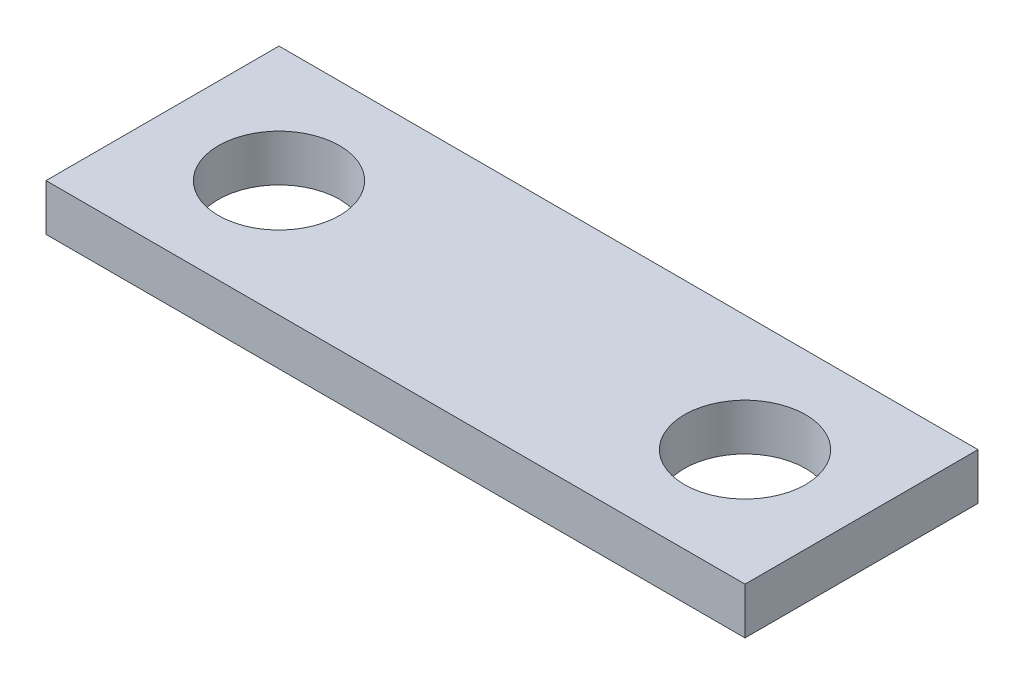
ISO-10303-21;
HEADER;
FILE_DESCRIPTION(('STEP AP214'),'2;1');
FILE_NAME('part.step','',(''),(''),'','','');
FILE_SCHEMA(('AUTOMOTIVE_DESIGN { 1 0 10303 214 1 1 1 1 }'));
ENDSEC;
DATA;
#1=APPLICATION_CONTEXT('core data for automotive mechanical design processes');
#2=APPLICATION_PROTOCOL_DEFINITION('international standard','automotive_design',2000,#1);
#3=PRODUCT_CONTEXT('',#1,'mechanical');
#4=PRODUCT('Part','Part','',(#3));
#5=PRODUCT_RELATED_PRODUCT_CATEGORY('part','',(#4));
#6=PRODUCT_DEFINITION_FORMATION('','',#4);
#7=PRODUCT_DEFINITION_CONTEXT('part definition',#1,'design');
#8=PRODUCT_DEFINITION('design','',#6,#7);
#9=PRODUCT_DEFINITION_SHAPE('','',#8);
#10=(LENGTH_UNIT() NAMED_UNIT(*) SI_UNIT(.MILLI.,.METRE.));
#11=(NAMED_UNIT(*) PLANE_ANGLE_UNIT() SI_UNIT($,.RADIAN.));
#12=(NAMED_UNIT(*) SI_UNIT($,.STERADIAN.) SOLID_ANGLE_UNIT());
#13=UNCERTAINTY_MEASURE_WITH_UNIT(LENGTH_MEASURE(1.E-05),#10,'distance_accuracy_value','');
#14=(GEOMETRIC_REPRESENTATION_CONTEXT(3) GLOBAL_UNCERTAINTY_ASSIGNED_CONTEXT((#13)) GLOBAL_UNIT_ASSIGNED_CONTEXT((#10,
#11,#12)) REPRESENTATION_CONTEXT('',''));
#15=CARTESIAN_POINT('',(0.,0.,0.));
#16=DIRECTION('',(0.,0.,1.));
#17=DIRECTION('',(1.,0.,0.));
#18=AXIS2_PLACEMENT_3D('',#15,#16,#17);
#19=CARTESIAN_POINT('',(0.,2.,5.));
#20=DIRECTION('',(0.,0.,-1.));
#21=DIRECTION('',(-1.,0.,0.));
#22=AXIS2_PLACEMENT_3D('',#19,#20,#21);
#23=PLANE('',#22);
#24=DIRECTION('',(1.,0.,0.));
#25=VECTOR('',#24,1.);
#26=CARTESIAN_POINT('',(0.,0.,5.));
#27=LINE('',#26,#25);
#28=CARTESIAN_POINT('',(-15.,0.,5.));
#29=VERTEX_POINT('',#28);
#30=CARTESIAN_POINT('',(15.,0.,5.));
#31=VERTEX_POINT('',#30);
#32=EDGE_CURVE('E114',#29,#31,#27,.T.);
#33=ORIENTED_EDGE('',*,*,#32,.T.);
#34=DIRECTION('',(0.,-1.,0.));
#35=VECTOR('',#34,1.);
#36=CARTESIAN_POINT('',(15.,2.,5.));
#37=LINE('',#36,#35);
#38=CARTESIAN_POINT('',(15.,2.,5.));
#39=VERTEX_POINT('',#38);
#40=EDGE_CURVE('E11',#39,#31,#37,.T.);
#41=ORIENTED_EDGE('',*,*,#40,.F.);
#42=DIRECTION('',(1.,0.,0.));
#43=VECTOR('',#42,1.);
#44=CARTESIAN_POINT('',(0.,2.,5.));
#45=LINE('',#44,#43);
#46=CARTESIAN_POINT('',(-15.,2.,5.));
#47=VERTEX_POINT('',#46);
#48=EDGE_CURVE('E96',#47,#39,#45,.T.);
#49=ORIENTED_EDGE('',*,*,#48,.F.);
#50=DIRECTION('',(0.,-1.,0.));
#51=VECTOR('',#50,1.);
#52=CARTESIAN_POINT('',(-15.,2.,5.));
#53=LINE('',#52,#51);
#54=EDGE_CURVE('E63',#47,#29,#53,.T.);
#55=ORIENTED_EDGE('',*,*,#54,.T.);
#56=EDGE_LOOP('',(#33,#41,#49,#55));
#57=FACE_BOUND('',#56,.T.);
#58=ADVANCED_FACE('F46',(#57),#23,.F.);
#59=CARTESIAN_POINT('',(15.,2.,0.));
#60=DIRECTION('',(-1.,0.,0.));
#61=DIRECTION('',(0.,0.,1.));
#62=AXIS2_PLACEMENT_3D('',#59,#60,#61);
#63=PLANE('',#62);
#64=DIRECTION('',(0.,0.,-1.));
#65=VECTOR('',#64,1.);
#66=CARTESIAN_POINT('',(15.,0.,0.));
#67=LINE('',#66,#65);
#68=CARTESIAN_POINT('',(15.,0.,-5.));
#69=VERTEX_POINT('',#68);
#70=EDGE_CURVE('E102',#31,#69,#67,.T.);
#71=ORIENTED_EDGE('',*,*,#70,.T.);
#72=DIRECTION('',(0.,-1.,0.));
#73=VECTOR('',#72,1.);
#74=CARTESIAN_POINT('',(15.,2.,-5.));
#75=LINE('',#74,#73);
#76=CARTESIAN_POINT('',(15.,2.,-5.));
#77=VERTEX_POINT('',#76);
#78=EDGE_CURVE('E55',#77,#69,#75,.T.);
#79=ORIENTED_EDGE('',*,*,#78,.F.);
#80=DIRECTION('',(0.,0.,-1.));
#81=VECTOR('',#80,1.);
#82=CARTESIAN_POINT('',(15.,2.,0.));
#83=LINE('',#82,#81);
#84=EDGE_CURVE('E88',#39,#77,#83,.T.);
#85=ORIENTED_EDGE('',*,*,#84,.F.);
#86=ORIENTED_EDGE('',*,*,#40,.T.);
#87=EDGE_LOOP('',(#71,#79,#85,#86));
#88=FACE_BOUND('',#87,.T.);
#89=ADVANCED_FACE('F101',(#88),#63,.F.);
#90=CARTESIAN_POINT('',(0.,2.,-5.));
#91=DIRECTION('',(0.,0.,-1.));
#92=DIRECTION('',(-1.,0.,0.));
#93=AXIS2_PLACEMENT_3D('',#90,#91,#92);
#94=PLANE('',#93);
#95=DIRECTION('',(1.,0.,0.));
#96=VECTOR('',#95,1.);
#97=CARTESIAN_POINT('',(0.,0.,-5.));
#98=LINE('',#97,#96);
#99=CARTESIAN_POINT('',(-15.,0.,-5.));
#100=VERTEX_POINT('',#99);
#101=EDGE_CURVE('E120',#100,#69,#98,.T.);
#102=ORIENTED_EDGE('',*,*,#101,.F.);
#103=DIRECTION('',(0.,-1.,0.));
#104=VECTOR('',#103,1.);
#105=CARTESIAN_POINT('',(-15.,2.,-5.));
#106=LINE('',#105,#104);
#107=CARTESIAN_POINT('',(-15.,2.,-5.));
#108=VERTEX_POINT('',#107);
#109=EDGE_CURVE('E77',#108,#100,#106,.T.);
#110=ORIENTED_EDGE('',*,*,#109,.F.);
#111=DIRECTION('',(1.,0.,0.));
#112=VECTOR('',#111,1.);
#113=CARTESIAN_POINT('',(0.,2.,-5.));
#114=LINE('',#113,#112);
#115=EDGE_CURVE('E95',#108,#77,#114,.T.);
#116=ORIENTED_EDGE('',*,*,#115,.T.);
#117=ORIENTED_EDGE('',*,*,#78,.T.);
#118=EDGE_LOOP('',(#102,#110,#116,#117));
#119=FACE_BOUND('',#118,.T.);
#120=ADVANCED_FACE('F106',(#119),#94,.T.);
#121=CARTESIAN_POINT('',(-15.,2.,0.));
#122=DIRECTION('',(-1.,0.,0.));
#123=DIRECTION('',(0.,0.,1.));
#124=AXIS2_PLACEMENT_3D('',#121,#122,#123);
#125=PLANE('',#124);
#126=DIRECTION('',(0.,0.,-1.));
#127=VECTOR('',#126,1.);
#128=CARTESIAN_POINT('',(-15.,0.,0.));
#129=LINE('',#128,#127);
#130=EDGE_CURVE('E123',#29,#100,#129,.T.);
#131=ORIENTED_EDGE('',*,*,#130,.F.);
#132=ORIENTED_EDGE('',*,*,#54,.F.);
#133=DIRECTION('',(0.,0.,-1.));
#134=VECTOR('',#133,1.);
#135=CARTESIAN_POINT('',(-15.,2.,0.));
#136=LINE('',#135,#134);
#137=EDGE_CURVE('E108',#47,#108,#136,.T.);
#138=ORIENTED_EDGE('',*,*,#137,.T.);
#139=ORIENTED_EDGE('',*,*,#109,.T.);
#140=EDGE_LOOP('',(#131,#132,#138,#139));
#141=FACE_BOUND('',#140,.T.);
#142=ADVANCED_FACE('F157',(#141),#125,.T.);
#143=CARTESIAN_POINT('',(0.,2.,0.));
#144=DIRECTION('',(0.,1.,0.));
#145=DIRECTION('',(0.,0.,1.));
#146=AXIS2_PLACEMENT_3D('',#143,#144,#145);
#147=PLANE('',#146);
#148=CARTESIAN_POINT('',(9.99999999999999,2.,0.));
#149=DIRECTION('',(0.,1.,0.));
#150=DIRECTION('',(0.,0.,1.));
#151=AXIS2_PLACEMENT_3D('',#148,#149,#150);
#152=CIRCLE('',#151,2.6);
#153=CARTESIAN_POINT('',(9.99999999999999,2.,2.6));
#154=VERTEX_POINT('',#153);
#155=EDGE_CURVE('E117',#154,#154,#152,.T.);
#156=ORIENTED_EDGE('',*,*,#155,.F.);
#157=EDGE_LOOP('',(#156));
#158=FACE_BOUND('',#157,.T.);
#159=CARTESIAN_POINT('',(-10.,2.,0.));
#160=DIRECTION('',(0.,1.,0.));
#161=DIRECTION('',(0.,0.,1.));
#162=AXIS2_PLACEMENT_3D('',#159,#160,#161);
#163=CIRCLE('',#162,2.6);
#164=CARTESIAN_POINT('',(-10.,2.,2.6));
#165=VERTEX_POINT('',#164);
#166=EDGE_CURVE('E136',#165,#165,#163,.T.);
#167=ORIENTED_EDGE('',*,*,#166,.F.);
#168=EDGE_LOOP('',(#167));
#169=FACE_BOUND('',#168,.T.);
#170=ORIENTED_EDGE('',*,*,#48,.T.);
#171=ORIENTED_EDGE('',*,*,#84,.T.);
#172=ORIENTED_EDGE('',*,*,#115,.F.);
#173=ORIENTED_EDGE('',*,*,#137,.F.);
#174=EDGE_LOOP('',(#170,#171,#172,#173));
#175=FACE_BOUND('',#174,.T.);
#176=ADVANCED_FACE('F92',(#158,#169,#175),#147,.T.);
#177=CARTESIAN_POINT('',(0.,0.,0.));
#178=DIRECTION('',(0.,1.,0.));
#179=DIRECTION('',(0.,0.,1.));
#180=AXIS2_PLACEMENT_3D('',#177,#178,#179);
#181=PLANE('',#180);
#182=CARTESIAN_POINT('',(9.99999999999999,0.,0.));
#183=DIRECTION('',(0.,-1.,0.));
#184=DIRECTION('',(0.,0.,-1.));
#185=AXIS2_PLACEMENT_3D('',#182,#183,#184);
#186=CIRCLE('',#185,2.6);
#187=CARTESIAN_POINT('',(9.99999999999999,0.,-2.6));
#188=VERTEX_POINT('',#187);
#189=EDGE_CURVE('E140',#188,#188,#186,.T.);
#190=ORIENTED_EDGE('',*,*,#189,.F.);
#191=EDGE_LOOP('',(#190));
#192=FACE_BOUND('',#191,.T.);
#193=CARTESIAN_POINT('',(-10.,0.,0.));
#194=DIRECTION('',(0.,-1.,0.));
#195=DIRECTION('',(0.,0.,-1.));
#196=AXIS2_PLACEMENT_3D('',#193,#194,#195);
#197=CIRCLE('',#196,2.6);
#198=CARTESIAN_POINT('',(-10.,0.,-2.6));
#199=VERTEX_POINT('',#198);
#200=EDGE_CURVE('E141',#199,#199,#197,.T.);
#201=ORIENTED_EDGE('',*,*,#200,.F.);
#202=EDGE_LOOP('',(#201));
#203=FACE_BOUND('',#202,.T.);
#204=ORIENTED_EDGE('',*,*,#32,.F.);
#205=ORIENTED_EDGE('',*,*,#130,.T.);
#206=ORIENTED_EDGE('',*,*,#101,.T.);
#207=ORIENTED_EDGE('',*,*,#70,.F.);
#208=EDGE_LOOP('',(#204,#205,#206,#207));
#209=FACE_BOUND('',#208,.T.);
#210=ADVANCED_FACE('F151',(#192,#203,#209),#181,.F.);
#211=CARTESIAN_POINT('',(-10.,10.,0.));
#212=DIRECTION('',(0.,-1.,0.));
#213=DIRECTION('',(0.,0.,-1.));
#214=AXIS2_PLACEMENT_3D('',#211,#212,#213);
#215=CYLINDRICAL_SURFACE('',#214,2.6);
#216=ORIENTED_EDGE('',*,*,#166,.T.);
#217=EDGE_LOOP('',(#216));
#218=FACE_BOUND('',#217,.T.);
#219=ORIENTED_EDGE('',*,*,#200,.T.);
#220=EDGE_LOOP('',(#219));
#221=FACE_BOUND('',#220,.T.);
#222=ADVANCED_FACE('F154',(#218,#221),#215,.F.);
#223=CARTESIAN_POINT('',(9.99999999999999,10.,0.));
#224=DIRECTION('',(0.,-1.,0.));
#225=DIRECTION('',(0.,0.,-1.));
#226=AXIS2_PLACEMENT_3D('',#223,#224,#225);
#227=CYLINDRICAL_SURFACE('',#226,2.6);
#228=ORIENTED_EDGE('',*,*,#155,.T.);
#229=EDGE_LOOP('',(#228));
#230=FACE_BOUND('',#229,.T.);
#231=ORIENTED_EDGE('',*,*,#189,.T.);
#232=EDGE_LOOP('',(#231));
#233=FACE_BOUND('',#232,.T.);
#234=ADVANCED_FACE('F149',(#230,#233),#227,.F.);
#235=CLOSED_SHELL('',(#58,#89,#120,#142,#176,#210,#222,#234));
#236=MANIFOLD_SOLID_BREP('B2',#235);
#237=ADVANCED_BREP_SHAPE_REPRESENTATION('',(#18,#236),#14);
#238=SHAPE_DEFINITION_REPRESENTATION(#9,#237);
ENDSEC;
END-ISO-10303-21;
